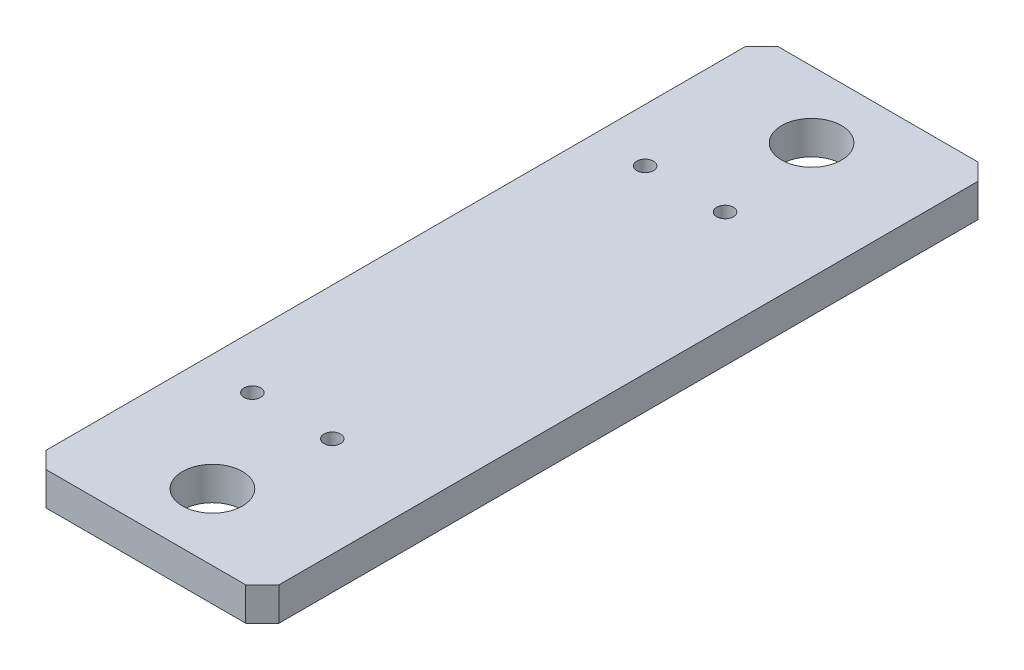
ISO-10303-21;
HEADER;
FILE_DESCRIPTION(('STEP AP214'),'2;1');
FILE_NAME('part.step','',(''),(''),'','','');
FILE_SCHEMA(('AUTOMOTIVE_DESIGN { 1 0 10303 214 1 1 1 1 }'));
ENDSEC;
DATA;
#1=APPLICATION_CONTEXT('core data for automotive mechanical design processes');
#2=APPLICATION_PROTOCOL_DEFINITION('international standard','automotive_design',2000,#1);
#3=PRODUCT_CONTEXT('',#1,'mechanical');
#4=PRODUCT('Part','Part','',(#3));
#5=PRODUCT_RELATED_PRODUCT_CATEGORY('part','',(#4));
#6=PRODUCT_DEFINITION_FORMATION('','',#4);
#7=PRODUCT_DEFINITION_CONTEXT('part definition',#1,'design');
#8=PRODUCT_DEFINITION('design','',#6,#7);
#9=PRODUCT_DEFINITION_SHAPE('','',#8);
#10=(LENGTH_UNIT() NAMED_UNIT(*) SI_UNIT(.MILLI.,.METRE.));
#11=(NAMED_UNIT(*) PLANE_ANGLE_UNIT() SI_UNIT($,.RADIAN.));
#12=(NAMED_UNIT(*) SI_UNIT($,.STERADIAN.) SOLID_ANGLE_UNIT());
#13=UNCERTAINTY_MEASURE_WITH_UNIT(LENGTH_MEASURE(1.E-05),#10,'distance_accuracy_value','');
#14=(GEOMETRIC_REPRESENTATION_CONTEXT(3) GLOBAL_UNCERTAINTY_ASSIGNED_CONTEXT((#13)) GLOBAL_UNIT_ASSIGNED_CONTEXT((#10,
#11,#12)) REPRESENTATION_CONTEXT('',''));
#15=CARTESIAN_POINT('',(0.,0.,0.));
#16=DIRECTION('',(0.,0.,1.));
#17=DIRECTION('',(1.,0.,0.));
#18=AXIS2_PLACEMENT_3D('',#15,#16,#17);
#19=CARTESIAN_POINT('',(-35.,10.,-110.));
#20=DIRECTION('',(1.,0.,0.));
#21=DIRECTION('',(0.,0.,-1.));
#22=AXIS2_PLACEMENT_3D('',#19,#20,#21);
#23=PLANE('',#22);
#24=DIRECTION('',(0.,0.,1.));
#25=VECTOR('',#24,1.);
#26=CARTESIAN_POINT('',(-35.,10.,-110.));
#27=LINE('',#26,#25);
#28=CARTESIAN_POINT('',(-35.,10.,-105.));
#29=VERTEX_POINT('',#28);
#30=CARTESIAN_POINT('',(-35.,10.,105.));
#31=VERTEX_POINT('',#30);
#32=EDGE_CURVE('E120',#29,#31,#27,.T.);
#33=ORIENTED_EDGE('',*,*,#32,.F.);
#34=DIRECTION('',(0.,-1.,0.));
#35=VECTOR('',#34,1.);
#36=CARTESIAN_POINT('',(-35.,10.,-105.));
#37=LINE('',#36,#35);
#38=CARTESIAN_POINT('',(-35.,0.,-105.));
#39=VERTEX_POINT('',#38);
#40=EDGE_CURVE('E105',#29,#39,#37,.T.);
#41=ORIENTED_EDGE('',*,*,#40,.T.);
#42=DIRECTION('',(0.,0.,1.));
#43=VECTOR('',#42,1.);
#44=CARTESIAN_POINT('',(-35.,0.,-110.));
#45=LINE('',#44,#43);
#46=CARTESIAN_POINT('',(-35.,0.,105.));
#47=VERTEX_POINT('',#46);
#48=EDGE_CURVE('E117',#39,#47,#45,.T.);
#49=ORIENTED_EDGE('',*,*,#48,.T.);
#50=DIRECTION('',(0.,1.,0.));
#51=VECTOR('',#50,1.);
#52=CARTESIAN_POINT('',(-35.,10.,105.));
#53=LINE('',#52,#51);
#54=EDGE_CURVE('E122',#47,#31,#53,.T.);
#55=ORIENTED_EDGE('',*,*,#54,.T.);
#56=EDGE_LOOP('',(#33,#41,#49,#55));
#57=FACE_BOUND('',#56,.T.);
#58=ADVANCED_FACE('F34',(#57),#23,.F.);
#59=CARTESIAN_POINT('',(-35.,10.,110.));
#60=DIRECTION('',(0.,0.,-1.));
#61=DIRECTION('',(-1.,0.,0.));
#62=AXIS2_PLACEMENT_3D('',#59,#60,#61);
#63=PLANE('',#62);
#64=DIRECTION('',(1.,0.,0.));
#65=VECTOR('',#64,1.);
#66=CARTESIAN_POINT('',(-35.,10.,110.));
#67=LINE('',#66,#65);
#68=CARTESIAN_POINT('',(-30.,10.,110.));
#69=VERTEX_POINT('',#68);
#70=CARTESIAN_POINT('',(30.,10.,110.));
#71=VERTEX_POINT('',#70);
#72=EDGE_CURVE('E164',#69,#71,#67,.T.);
#73=ORIENTED_EDGE('',*,*,#72,.F.);
#74=DIRECTION('',(0.,-1.,0.));
#75=VECTOR('',#74,1.);
#76=CARTESIAN_POINT('',(-30.,10.,110.));
#77=LINE('',#76,#75);
#78=CARTESIAN_POINT('',(-30.,0.,110.));
#79=VERTEX_POINT('',#78);
#80=EDGE_CURVE('E11',#69,#79,#77,.T.);
#81=ORIENTED_EDGE('',*,*,#80,.T.);
#82=DIRECTION('',(1.,0.,0.));
#83=VECTOR('',#82,1.);
#84=CARTESIAN_POINT('',(-35.,0.,110.));
#85=LINE('',#84,#83);
#86=CARTESIAN_POINT('',(30.,0.,110.));
#87=VERTEX_POINT('',#86);
#88=EDGE_CURVE('E127',#79,#87,#85,.T.);
#89=ORIENTED_EDGE('',*,*,#88,.T.);
#90=DIRECTION('',(0.,1.,0.));
#91=VECTOR('',#90,1.);
#92=CARTESIAN_POINT('',(30.,10.,110.));
#93=LINE('',#92,#91);
#94=EDGE_CURVE('E42',#87,#71,#93,.T.);
#95=ORIENTED_EDGE('',*,*,#94,.T.);
#96=EDGE_LOOP('',(#73,#81,#89,#95));
#97=FACE_BOUND('',#96,.T.);
#98=ADVANCED_FACE('F163',(#97),#63,.F.);
#99=CARTESIAN_POINT('',(35.,10.,-110.));
#100=DIRECTION('',(-1.,0.,0.));
#101=DIRECTION('',(0.,0.,1.));
#102=AXIS2_PLACEMENT_3D('',#99,#100,#101);
#103=PLANE('',#102);
#104=DIRECTION('',(0.,0.,-1.));
#105=VECTOR('',#104,1.);
#106=CARTESIAN_POINT('',(35.,0.,-110.));
#107=LINE('',#106,#105);
#108=CARTESIAN_POINT('',(35.,0.,105.));
#109=VERTEX_POINT('',#108);
#110=CARTESIAN_POINT('',(35.,0.,-105.));
#111=VERTEX_POINT('',#110);
#112=EDGE_CURVE('E131',#109,#111,#107,.T.);
#113=ORIENTED_EDGE('',*,*,#112,.T.);
#114=DIRECTION('',(0.,1.,0.));
#115=VECTOR('',#114,1.);
#116=CARTESIAN_POINT('',(35.,10.,-105.));
#117=LINE('',#116,#115);
#118=CARTESIAN_POINT('',(35.,10.,-105.));
#119=VERTEX_POINT('',#118);
#120=EDGE_CURVE('E49',#111,#119,#117,.T.);
#121=ORIENTED_EDGE('',*,*,#120,.T.);
#122=DIRECTION('',(0.,0.,-1.));
#123=VECTOR('',#122,1.);
#124=CARTESIAN_POINT('',(35.,10.,-110.));
#125=LINE('',#124,#123);
#126=CARTESIAN_POINT('',(35.,10.,105.));
#127=VERTEX_POINT('',#126);
#128=EDGE_CURVE('E170',#127,#119,#125,.T.);
#129=ORIENTED_EDGE('',*,*,#128,.F.);
#130=DIRECTION('',(0.,-1.,0.));
#131=VECTOR('',#130,1.);
#132=CARTESIAN_POINT('',(35.,10.,105.));
#133=LINE('',#132,#131);
#134=EDGE_CURVE('E157',#127,#109,#133,.T.);
#135=ORIENTED_EDGE('',*,*,#134,.T.);
#136=EDGE_LOOP('',(#113,#121,#129,#135));
#137=FACE_BOUND('',#136,.T.);
#138=ADVANCED_FACE('F174',(#137),#103,.F.);
#139=CARTESIAN_POINT('',(-35.,10.,-110.));
#140=DIRECTION('',(0.,0.,1.));
#141=DIRECTION('',(1.,0.,0.));
#142=AXIS2_PLACEMENT_3D('',#139,#140,#141);
#143=PLANE('',#142);
#144=DIRECTION('',(-1.,0.,0.));
#145=VECTOR('',#144,1.);
#146=CARTESIAN_POINT('',(-35.,0.,-110.));
#147=LINE('',#146,#145);
#148=CARTESIAN_POINT('',(30.,0.,-110.));
#149=VERTEX_POINT('',#148);
#150=CARTESIAN_POINT('',(-30.,0.,-110.));
#151=VERTEX_POINT('',#150);
#152=EDGE_CURVE('E141',#149,#151,#147,.T.);
#153=ORIENTED_EDGE('',*,*,#152,.T.);
#154=DIRECTION('',(0.,1.,0.));
#155=VECTOR('',#154,1.);
#156=CARTESIAN_POINT('',(-30.,10.,-110.));
#157=LINE('',#156,#155);
#158=CARTESIAN_POINT('',(-29.9999999999999,10.,-110.));
#159=VERTEX_POINT('',#158);
#160=EDGE_CURVE('E106',#151,#159,#157,.T.);
#161=ORIENTED_EDGE('',*,*,#160,.T.);
#162=DIRECTION('',(-1.,0.,0.));
#163=VECTOR('',#162,1.);
#164=CARTESIAN_POINT('',(-35.,10.,-110.));
#165=LINE('',#164,#163);
#166=CARTESIAN_POINT('',(30.,10.,-110.));
#167=VERTEX_POINT('',#166);
#168=EDGE_CURVE('E137',#167,#159,#165,.T.);
#169=ORIENTED_EDGE('',*,*,#168,.F.);
#170=DIRECTION('',(0.,-1.,0.));
#171=VECTOR('',#170,1.);
#172=CARTESIAN_POINT('',(30.,10.,-110.));
#173=LINE('',#172,#171);
#174=EDGE_CURVE('E111',#167,#149,#173,.T.);
#175=ORIENTED_EDGE('',*,*,#174,.T.);
#176=EDGE_LOOP('',(#153,#161,#169,#175));
#177=FACE_BOUND('',#176,.T.);
#178=ADVANCED_FACE('F181',(#177),#143,.F.);
#179=CARTESIAN_POINT('',(-35.,10.,110.));
#180=DIRECTION('',(0.,1.,0.));
#181=DIRECTION('',(0.,0.,1.));
#182=AXIS2_PLACEMENT_3D('',#179,#180,#181);
#183=PLANE('',#182);
#184=CARTESIAN_POINT('',(0.,10.,-90.));
#185=DIRECTION('',(0.,1.,0.));
#186=DIRECTION('',(0.,0.,1.));
#187=AXIS2_PLACEMENT_3D('',#184,#185,#186);
#188=CIRCLE('',#187,8.99999999999999);
#189=CARTESIAN_POINT('',(0.,10.,-81.));
#190=VERTEX_POINT('',#189);
#191=EDGE_CURVE('E213',#190,#190,#188,.T.);
#192=ORIENTED_EDGE('',*,*,#191,.F.);
#193=EDGE_LOOP('',(#192));
#194=FACE_BOUND('',#193,.T.);
#195=CARTESIAN_POINT('',(0.,10.,90.));
#196=DIRECTION('',(0.,1.,0.));
#197=DIRECTION('',(0.,0.,1.));
#198=AXIS2_PLACEMENT_3D('',#195,#196,#197);
#199=CIRCLE('',#198,8.99999999999999);
#200=CARTESIAN_POINT('',(0.,10.,99.));
#201=VERTEX_POINT('',#200);
#202=EDGE_CURVE('E207',#201,#201,#199,.T.);
#203=ORIENTED_EDGE('',*,*,#202,.F.);
#204=EDGE_LOOP('',(#203));
#205=FACE_BOUND('',#204,.T.);
#206=CARTESIAN_POINT('',(-19.,10.,-59.));
#207=DIRECTION('',(0.,1.,0.));
#208=DIRECTION('',(0.,0.,1.));
#209=AXIS2_PLACEMENT_3D('',#206,#207,#208);
#210=CIRCLE('',#209,2.49999999999999);
#211=CARTESIAN_POINT('',(-19.,10.,-56.5));
#212=VERTEX_POINT('',#211);
#213=EDGE_CURVE('E201',#212,#212,#210,.T.);
#214=ORIENTED_EDGE('',*,*,#213,.F.);
#215=EDGE_LOOP('',(#214));
#216=FACE_BOUND('',#215,.T.);
#217=CARTESIAN_POINT('',(-19.,10.,59.));
#218=DIRECTION('',(0.,1.,0.));
#219=DIRECTION('',(0.,0.,1.));
#220=AXIS2_PLACEMENT_3D('',#217,#218,#219);
#221=CIRCLE('',#220,2.49999999999999);
#222=CARTESIAN_POINT('',(-19.,10.,61.5));
#223=VERTEX_POINT('',#222);
#224=EDGE_CURVE('E195',#223,#223,#221,.T.);
#225=ORIENTED_EDGE('',*,*,#224,.F.);
#226=EDGE_LOOP('',(#225));
#227=FACE_BOUND('',#226,.T.);
#228=CARTESIAN_POINT('',(5.00000000000002,10.,-59.));
#229=DIRECTION('',(0.,1.,0.));
#230=DIRECTION('',(0.,0.,1.));
#231=AXIS2_PLACEMENT_3D('',#228,#229,#230);
#232=CIRCLE('',#231,2.49999999999999);
#233=CARTESIAN_POINT('',(5.00000000000002,10.,-56.5));
#234=VERTEX_POINT('',#233);
#235=EDGE_CURVE('E189',#234,#234,#232,.T.);
#236=ORIENTED_EDGE('',*,*,#235,.F.);
#237=EDGE_LOOP('',(#236));
#238=FACE_BOUND('',#237,.T.);
#239=CARTESIAN_POINT('',(5.00000000000004,10.,59.));
#240=DIRECTION('',(0.,1.,0.));
#241=DIRECTION('',(0.,0.,1.));
#242=AXIS2_PLACEMENT_3D('',#239,#240,#241);
#243=CIRCLE('',#242,2.49999999999999);
#244=CARTESIAN_POINT('',(5.00000000000004,10.,61.5));
#245=VERTEX_POINT('',#244);
#246=EDGE_CURVE('E134',#245,#245,#243,.T.);
#247=ORIENTED_EDGE('',*,*,#246,.F.);
#248=EDGE_LOOP('',(#247));
#249=FACE_BOUND('',#248,.T.);
#250=ORIENTED_EDGE('',*,*,#168,.T.);
#251=DIRECTION('',(0.707106781186548,0.,-0.707106781186548));
#252=VECTOR('',#251,1.);
#253=CARTESIAN_POINT('',(-142.5,10.,2.5));
#254=LINE('',#253,#252);
#255=EDGE_CURVE('E155',#159,#29,#254,.F.);
#256=ORIENTED_EDGE('',*,*,#255,.T.);
#257=ORIENTED_EDGE('',*,*,#32,.T.);
#258=DIRECTION('',(-0.707106781186546,0.,-0.707106781186549));
#259=VECTOR('',#258,1.);
#260=CARTESIAN_POINT('',(-32.5,10.,107.5));
#261=LINE('',#260,#259);
#262=EDGE_CURVE('E151',#31,#69,#261,.F.);
#263=ORIENTED_EDGE('',*,*,#262,.T.);
#264=ORIENTED_EDGE('',*,*,#72,.T.);
#265=DIRECTION('',(-0.707106781186546,0.,0.707106781186549));
#266=VECTOR('',#265,1.);
#267=CARTESIAN_POINT('',(-2.49999999999979,10.,142.5));
#268=LINE('',#267,#266);
#269=EDGE_CURVE('E56',#71,#127,#268,.F.);
#270=ORIENTED_EDGE('',*,*,#269,.T.);
#271=ORIENTED_EDGE('',*,*,#128,.T.);
#272=DIRECTION('',(0.707106781186546,0.,0.707106781186549));
#273=VECTOR('',#272,1.);
#274=CARTESIAN_POINT('',(107.5,10.,-32.4999999999994));
#275=LINE('',#274,#273);
#276=EDGE_CURVE('E153',#119,#167,#275,.F.);
#277=ORIENTED_EDGE('',*,*,#276,.T.);
#278=EDGE_LOOP('',(#250,#256,#257,#263,#264,#270,#271,#277));
#279=FACE_BOUND('',#278,.T.);
#280=ADVANCED_FACE('F168',(#194,#205,#216,#227,#238,#249,#279),#183,.T.);
#281=CARTESIAN_POINT('',(-35.,0.,110.));
#282=DIRECTION('',(0.,1.,0.));
#283=DIRECTION('',(0.,0.,1.));
#284=AXIS2_PLACEMENT_3D('',#281,#282,#283);
#285=PLANE('',#284);
#286=CARTESIAN_POINT('',(0.,0.,-90.));
#287=DIRECTION('',(0.,1.,0.));
#288=DIRECTION('',(0.,0.,1.));
#289=AXIS2_PLACEMENT_3D('',#286,#287,#288);
#290=CIRCLE('',#289,8.99999999999999);
#291=CARTESIAN_POINT('',(0.,0.,-81.));
#292=VERTEX_POINT('',#291);
#293=EDGE_CURVE('E210',#292,#292,#290,.T.);
#294=ORIENTED_EDGE('',*,*,#293,.T.);
#295=EDGE_LOOP('',(#294));
#296=FACE_BOUND('',#295,.T.);
#297=CARTESIAN_POINT('',(0.,0.,90.));
#298=DIRECTION('',(0.,1.,0.));
#299=DIRECTION('',(0.,0.,1.));
#300=AXIS2_PLACEMENT_3D('',#297,#298,#299);
#301=CIRCLE('',#300,8.99999999999999);
#302=CARTESIAN_POINT('',(0.,0.,99.));
#303=VERTEX_POINT('',#302);
#304=EDGE_CURVE('E204',#303,#303,#301,.T.);
#305=ORIENTED_EDGE('',*,*,#304,.T.);
#306=EDGE_LOOP('',(#305));
#307=FACE_BOUND('',#306,.T.);
#308=CARTESIAN_POINT('',(-19.,0.,-59.));
#309=DIRECTION('',(0.,1.,0.));
#310=DIRECTION('',(0.,0.,1.));
#311=AXIS2_PLACEMENT_3D('',#308,#309,#310);
#312=CIRCLE('',#311,2.49999999999999);
#313=CARTESIAN_POINT('',(-19.,0.,-56.5));
#314=VERTEX_POINT('',#313);
#315=EDGE_CURVE('E198',#314,#314,#312,.T.);
#316=ORIENTED_EDGE('',*,*,#315,.T.);
#317=EDGE_LOOP('',(#316));
#318=FACE_BOUND('',#317,.T.);
#319=CARTESIAN_POINT('',(-19.,0.,59.));
#320=DIRECTION('',(0.,1.,0.));
#321=DIRECTION('',(0.,0.,1.));
#322=AXIS2_PLACEMENT_3D('',#319,#320,#321);
#323=CIRCLE('',#322,2.49999999999999);
#324=CARTESIAN_POINT('',(-19.,0.,61.5));
#325=VERTEX_POINT('',#324);
#326=EDGE_CURVE('E192',#325,#325,#323,.T.);
#327=ORIENTED_EDGE('',*,*,#326,.T.);
#328=EDGE_LOOP('',(#327));
#329=FACE_BOUND('',#328,.T.);
#330=CARTESIAN_POINT('',(5.00000000000002,0.,-59.));
#331=DIRECTION('',(0.,1.,0.));
#332=DIRECTION('',(0.,0.,1.));
#333=AXIS2_PLACEMENT_3D('',#330,#331,#332);
#334=CIRCLE('',#333,2.49999999999999);
#335=CARTESIAN_POINT('',(5.00000000000002,0.,-56.5));
#336=VERTEX_POINT('',#335);
#337=EDGE_CURVE('E186',#336,#336,#334,.T.);
#338=ORIENTED_EDGE('',*,*,#337,.T.);
#339=EDGE_LOOP('',(#338));
#340=FACE_BOUND('',#339,.T.);
#341=CARTESIAN_POINT('',(5.00000000000004,0.,59.));
#342=DIRECTION('',(0.,1.,0.));
#343=DIRECTION('',(0.,0.,1.));
#344=AXIS2_PLACEMENT_3D('',#341,#342,#343);
#345=CIRCLE('',#344,2.49999999999999);
#346=CARTESIAN_POINT('',(5.00000000000004,0.,61.5));
#347=VERTEX_POINT('',#346);
#348=EDGE_CURVE('E128',#347,#347,#345,.T.);
#349=ORIENTED_EDGE('',*,*,#348,.T.);
#350=EDGE_LOOP('',(#349));
#351=FACE_BOUND('',#350,.T.);
#352=ORIENTED_EDGE('',*,*,#48,.F.);
#353=DIRECTION('',(-0.707106781186548,0.,0.707106781186548));
#354=VECTOR('',#353,1.);
#355=CARTESIAN_POINT('',(-35.,0.,-105.));
#356=LINE('',#355,#354);
#357=EDGE_CURVE('E101',#39,#151,#356,.F.);
#358=ORIENTED_EDGE('',*,*,#357,.T.);
#359=ORIENTED_EDGE('',*,*,#152,.F.);
#360=DIRECTION('',(-0.707106781186546,0.,-0.707106781186549));
#361=VECTOR('',#360,1.);
#362=CARTESIAN_POINT('',(30.,0.,-110.));
#363=LINE('',#362,#361);
#364=EDGE_CURVE('E112',#149,#111,#363,.F.);
#365=ORIENTED_EDGE('',*,*,#364,.T.);
#366=ORIENTED_EDGE('',*,*,#112,.F.);
#367=DIRECTION('',(0.707106781186546,0.,-0.707106781186549));
#368=VECTOR('',#367,1.);
#369=CARTESIAN_POINT('',(35.,0.,105.));
#370=LINE('',#369,#368);
#371=EDGE_CURVE('E121',#109,#87,#370,.F.);
#372=ORIENTED_EDGE('',*,*,#371,.T.);
#373=ORIENTED_EDGE('',*,*,#88,.F.);
#374=DIRECTION('',(0.707106781186546,0.,0.707106781186549));
#375=VECTOR('',#374,1.);
#376=CARTESIAN_POINT('',(-30.,0.,110.));
#377=LINE('',#376,#375);
#378=EDGE_CURVE('E126',#79,#47,#377,.F.);
#379=ORIENTED_EDGE('',*,*,#378,.T.);
#380=EDGE_LOOP('',(#352,#358,#359,#365,#366,#372,#373,#379));
#381=FACE_BOUND('',#380,.T.);
#382=ADVANCED_FACE('F124',(#296,#307,#318,#329,#340,#351,#381),#285,.F.);
#383=CARTESIAN_POINT('',(5.00000000000004,10.,59.));
#384=DIRECTION('',(0.,1.,0.));
#385=DIRECTION('',(0.,0.,1.));
#386=AXIS2_PLACEMENT_3D('',#383,#384,#385);
#387=CYLINDRICAL_SURFACE('',#386,2.49999999999999);
#388=ORIENTED_EDGE('',*,*,#348,.F.);
#389=EDGE_LOOP('',(#388));
#390=FACE_BOUND('',#389,.T.);
#391=ORIENTED_EDGE('',*,*,#246,.T.);
#392=EDGE_LOOP('',(#391));
#393=FACE_BOUND('',#392,.T.);
#394=ADVANCED_FACE('F232',(#390,#393),#387,.F.);
#395=CARTESIAN_POINT('',(5.00000000000002,10.,-59.));
#396=DIRECTION('',(0.,1.,0.));
#397=DIRECTION('',(0.,0.,1.));
#398=AXIS2_PLACEMENT_3D('',#395,#396,#397);
#399=CYLINDRICAL_SURFACE('',#398,2.49999999999999);
#400=ORIENTED_EDGE('',*,*,#337,.F.);
#401=EDGE_LOOP('',(#400));
#402=FACE_BOUND('',#401,.T.);
#403=ORIENTED_EDGE('',*,*,#235,.T.);
#404=EDGE_LOOP('',(#403));
#405=FACE_BOUND('',#404,.T.);
#406=ADVANCED_FACE('F234',(#402,#405),#399,.F.);
#407=CARTESIAN_POINT('',(-19.,10.,59.));
#408=DIRECTION('',(0.,1.,0.));
#409=DIRECTION('',(0.,0.,1.));
#410=AXIS2_PLACEMENT_3D('',#407,#408,#409);
#411=CYLINDRICAL_SURFACE('',#410,2.49999999999999);
#412=ORIENTED_EDGE('',*,*,#326,.F.);
#413=EDGE_LOOP('',(#412));
#414=FACE_BOUND('',#413,.T.);
#415=ORIENTED_EDGE('',*,*,#224,.T.);
#416=EDGE_LOOP('',(#415));
#417=FACE_BOUND('',#416,.T.);
#418=ADVANCED_FACE('F241',(#414,#417),#411,.F.);
#419=CARTESIAN_POINT('',(-19.,10.,-59.));
#420=DIRECTION('',(0.,1.,0.));
#421=DIRECTION('',(0.,0.,1.));
#422=AXIS2_PLACEMENT_3D('',#419,#420,#421);
#423=CYLINDRICAL_SURFACE('',#422,2.49999999999999);
#424=ORIENTED_EDGE('',*,*,#315,.F.);
#425=EDGE_LOOP('',(#424));
#426=FACE_BOUND('',#425,.T.);
#427=ORIENTED_EDGE('',*,*,#213,.T.);
#428=EDGE_LOOP('',(#427));
#429=FACE_BOUND('',#428,.T.);
#430=ADVANCED_FACE('F339',(#426,#429),#423,.F.);
#431=CARTESIAN_POINT('',(0.,10.,90.));
#432=DIRECTION('',(0.,1.,0.));
#433=DIRECTION('',(0.,0.,1.));
#434=AXIS2_PLACEMENT_3D('',#431,#432,#433);
#435=CYLINDRICAL_SURFACE('',#434,8.99999999999999);
#436=ORIENTED_EDGE('',*,*,#304,.F.);
#437=EDGE_LOOP('',(#436));
#438=FACE_BOUND('',#437,.T.);
#439=ORIENTED_EDGE('',*,*,#202,.T.);
#440=EDGE_LOOP('',(#439));
#441=FACE_BOUND('',#440,.T.);
#442=ADVANCED_FACE('F329',(#438,#441),#435,.F.);
#443=CARTESIAN_POINT('',(0.,10.,-90.));
#444=DIRECTION('',(0.,1.,0.));
#445=DIRECTION('',(0.,0.,1.));
#446=AXIS2_PLACEMENT_3D('',#443,#444,#445);
#447=CYLINDRICAL_SURFACE('',#446,8.99999999999999);
#448=ORIENTED_EDGE('',*,*,#293,.F.);
#449=EDGE_LOOP('',(#448));
#450=FACE_BOUND('',#449,.T.);
#451=ORIENTED_EDGE('',*,*,#191,.T.);
#452=EDGE_LOOP('',(#451));
#453=FACE_BOUND('',#452,.T.);
#454=ADVANCED_FACE('F217',(#450,#453),#447,.F.);
#455=CARTESIAN_POINT('',(-35.,10.,-105.));
#456=DIRECTION('',(0.707106781186547,0.,0.707106781186547));
#457=DIRECTION('',(0.707106781186548,0.,-0.707106781186548));
#458=AXIS2_PLACEMENT_3D('',#455,#456,#457);
#459=PLANE('',#458);
#460=ORIENTED_EDGE('',*,*,#255,.F.);
#461=ORIENTED_EDGE('',*,*,#160,.F.);
#462=ORIENTED_EDGE('',*,*,#357,.F.);
#463=ORIENTED_EDGE('',*,*,#40,.F.);
#464=EDGE_LOOP('',(#460,#461,#462,#463));
#465=FACE_BOUND('',#464,.T.);
#466=ADVANCED_FACE('F104',(#465),#459,.F.);
#467=CARTESIAN_POINT('',(30.,10.,-110.));
#468=DIRECTION('',(-0.707106781186549,0.,0.707106781186545));
#469=DIRECTION('',(0.707106781186546,0.,0.707106781186549));
#470=AXIS2_PLACEMENT_3D('',#467,#468,#469);
#471=PLANE('',#470);
#472=ORIENTED_EDGE('',*,*,#276,.F.);
#473=ORIENTED_EDGE('',*,*,#120,.F.);
#474=ORIENTED_EDGE('',*,*,#364,.F.);
#475=ORIENTED_EDGE('',*,*,#174,.F.);
#476=EDGE_LOOP('',(#472,#473,#474,#475));
#477=FACE_BOUND('',#476,.T.);
#478=ADVANCED_FACE('F178',(#477),#471,.F.);
#479=CARTESIAN_POINT('',(-30.,10.,110.));
#480=DIRECTION('',(0.707106781186549,0.,-0.707106781186545));
#481=DIRECTION('',(-0.707106781186546,0.,-0.707106781186549));
#482=AXIS2_PLACEMENT_3D('',#479,#480,#481);
#483=PLANE('',#482);
#484=ORIENTED_EDGE('',*,*,#262,.F.);
#485=ORIENTED_EDGE('',*,*,#54,.F.);
#486=ORIENTED_EDGE('',*,*,#378,.F.);
#487=ORIENTED_EDGE('',*,*,#80,.F.);
#488=EDGE_LOOP('',(#484,#485,#486,#487));
#489=FACE_BOUND('',#488,.T.);
#490=ADVANCED_FACE('F258',(#489),#483,.F.);
#491=CARTESIAN_POINT('',(35.,10.,105.));
#492=DIRECTION('',(-0.707106781186549,0.,-0.707106781186545));
#493=DIRECTION('',(-0.707106781186546,0.,0.707106781186549));
#494=AXIS2_PLACEMENT_3D('',#491,#492,#493);
#495=PLANE('',#494);
#496=ORIENTED_EDGE('',*,*,#269,.F.);
#497=ORIENTED_EDGE('',*,*,#94,.F.);
#498=ORIENTED_EDGE('',*,*,#371,.F.);
#499=ORIENTED_EDGE('',*,*,#134,.F.);
#500=EDGE_LOOP('',(#496,#497,#498,#499));
#501=FACE_BOUND('',#500,.T.);
#502=ADVANCED_FACE('F36',(#501),#495,.F.);
#503=CLOSED_SHELL('',(#58,#98,#138,#178,#280,#382,#394,#406,#418,#430,#442,#454,#466,#478,#490,#502));
#504=MANIFOLD_SOLID_BREP('B2',#503);
#505=ADVANCED_BREP_SHAPE_REPRESENTATION('',(#18,#504),#14);
#506=SHAPE_DEFINITION_REPRESENTATION(#9,#505);
ENDSEC;
END-ISO-10303-21;
